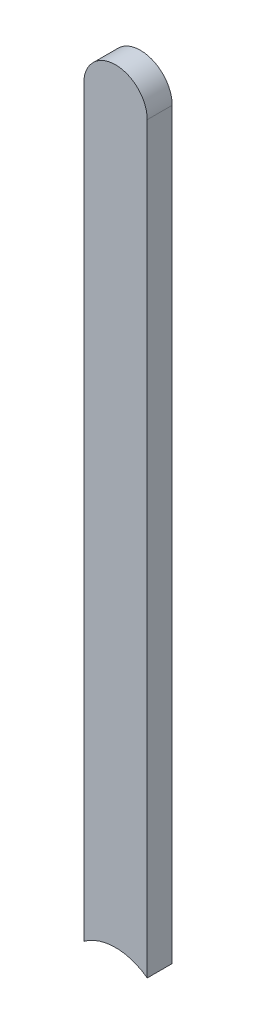
ISO-10303-21;
HEADER;
FILE_DESCRIPTION(('STEP AP214'),'2;1');
FILE_NAME('part.step','',(''),(''),'','','');
FILE_SCHEMA(('AUTOMOTIVE_DESIGN { 1 0 10303 214 1 1 1 1 }'));
ENDSEC;
DATA;
#1=APPLICATION_CONTEXT('core data for automotive mechanical design processes');
#2=APPLICATION_PROTOCOL_DEFINITION('international standard','automotive_design',2000,#1);
#3=PRODUCT_CONTEXT('',#1,'mechanical');
#4=PRODUCT('Part','Part','',(#3));
#5=PRODUCT_RELATED_PRODUCT_CATEGORY('part','',(#4));
#6=PRODUCT_DEFINITION_FORMATION('','',#4);
#7=PRODUCT_DEFINITION_CONTEXT('part definition',#1,'design');
#8=PRODUCT_DEFINITION('design','',#6,#7);
#9=PRODUCT_DEFINITION_SHAPE('','',#8);
#10=(LENGTH_UNIT() NAMED_UNIT(*) SI_UNIT(.MILLI.,.METRE.));
#11=(NAMED_UNIT(*) PLANE_ANGLE_UNIT() SI_UNIT($,.RADIAN.));
#12=(NAMED_UNIT(*) SI_UNIT($,.STERADIAN.) SOLID_ANGLE_UNIT());
#13=UNCERTAINTY_MEASURE_WITH_UNIT(LENGTH_MEASURE(1.E-05),#10,'distance_accuracy_value','');
#14=(GEOMETRIC_REPRESENTATION_CONTEXT(3) GLOBAL_UNCERTAINTY_ASSIGNED_CONTEXT((#13)) GLOBAL_UNIT_ASSIGNED_CONTEXT((#10,
#11,#12)) REPRESENTATION_CONTEXT('',''));
#15=CARTESIAN_POINT('',(0.,0.,0.));
#16=DIRECTION('',(0.,0.,1.));
#17=DIRECTION('',(1.,0.,0.));
#18=AXIS2_PLACEMENT_3D('',#15,#16,#17);
#19=CARTESIAN_POINT('',(134.366,66.1267482311035,0.));
#20=DIRECTION('',(-1.,0.,0.));
#21=DIRECTION('',(0.,1.,0.));
#22=AXIS2_PLACEMENT_3D('',#19,#20,#21);
#23=PLANE('',#22);
#24=DIRECTION('',(0.,1.,0.));
#25=VECTOR('',#24,1.);
#26=CARTESIAN_POINT('',(134.366,65.786,0.1999996));
#27=LINE('',#26,#25);
#28=CARTESIAN_POINT('',(134.366,66.1267482311035,0.1999996));
#29=VERTEX_POINT('',#28);
#30=CARTESIAN_POINT('',(134.366,72.0787992,0.1999996));
#31=VERTEX_POINT('',#30);
#32=EDGE_CURVE('E11',#29,#31,#27,.T.);
#33=ORIENTED_EDGE('',*,*,#32,.F.);
#34=DIRECTION('',(0.,0.,1.));
#35=VECTOR('',#34,1.);
#36=CARTESIAN_POINT('',(134.366,66.1267482311035,0.));
#37=LINE('',#36,#35);
#38=CARTESIAN_POINT('',(134.366,66.1267482311035,0.));
#39=VERTEX_POINT('',#38);
#40=EDGE_CURVE('E24',#39,#29,#37,.T.);
#41=ORIENTED_EDGE('',*,*,#40,.F.);
#42=DIRECTION('',(0.,1.,0.));
#43=VECTOR('',#42,1.);
#44=CARTESIAN_POINT('',(134.366,65.786,0.));
#45=LINE('',#44,#43);
#46=CARTESIAN_POINT('',(134.366,72.0787992,0.));
#47=VERTEX_POINT('',#46);
#48=EDGE_CURVE('E75',#39,#47,#45,.T.);
#49=ORIENTED_EDGE('',*,*,#48,.T.);
#50=DIRECTION('',(0.,0.,1.));
#51=VECTOR('',#50,1.);
#52=CARTESIAN_POINT('',(134.366,72.0787992,0.));
#53=LINE('',#52,#51);
#54=EDGE_CURVE('E37',#47,#31,#53,.T.);
#55=ORIENTED_EDGE('',*,*,#54,.T.);
#56=EDGE_LOOP('',(#33,#41,#49,#55));
#57=FACE_BOUND('',#56,.T.);
#58=ADVANCED_FACE('F17',(#57),#23,.F.);
#59=CARTESIAN_POINT('',(134.112,72.0787992,0.));
#60=DIRECTION('',(0.,0.,-1.));
#61=DIRECTION('',(1.,0.,0.));
#62=AXIS2_PLACEMENT_3D('',#59,#60,#61);
#63=CYLINDRICAL_SURFACE('',#62,0.254);
#64=CARTESIAN_POINT('',(134.112,72.0787992,0.1999996));
#65=DIRECTION('',(0.,0.,1.));
#66=DIRECTION('',(1.,0.,0.));
#67=AXIS2_PLACEMENT_3D('',#64,#65,#66);
#68=CIRCLE('',#67,0.254);
#69=CARTESIAN_POINT('',(133.858,72.0787992,0.1999996));
#70=VERTEX_POINT('',#69);
#71=EDGE_CURVE('E83',#31,#70,#68,.T.);
#72=ORIENTED_EDGE('',*,*,#71,.F.);
#73=ORIENTED_EDGE('',*,*,#54,.F.);
#74=CARTESIAN_POINT('',(134.112,72.0787992,0.));
#75=DIRECTION('',(0.,0.,1.));
#76=DIRECTION('',(1.,0.,0.));
#77=AXIS2_PLACEMENT_3D('',#74,#75,#76);
#78=CIRCLE('',#77,0.254);
#79=CARTESIAN_POINT('',(133.858,72.0787992,0.));
#80=VERTEX_POINT('',#79);
#81=EDGE_CURVE('E81',#47,#80,#78,.T.);
#82=ORIENTED_EDGE('',*,*,#81,.T.);
#83=DIRECTION('',(0.,0.,1.));
#84=VECTOR('',#83,1.);
#85=CARTESIAN_POINT('',(133.858,72.0787992,0.));
#86=LINE('',#85,#84);
#87=EDGE_CURVE('E67',#80,#70,#86,.T.);
#88=ORIENTED_EDGE('',*,*,#87,.T.);
#89=EDGE_LOOP('',(#72,#73,#82,#88));
#90=FACE_BOUND('',#89,.T.);
#91=ADVANCED_FACE('F89',(#90),#63,.T.);
#92=CARTESIAN_POINT('',(133.858,72.0787992,0.));
#93=DIRECTION('',(1.,0.,0.));
#94=DIRECTION('',(0.,-1.,0.));
#95=AXIS2_PLACEMENT_3D('',#92,#93,#94);
#96=PLANE('',#95);
#97=DIRECTION('',(0.,-1.,0.));
#98=VECTOR('',#97,1.);
#99=CARTESIAN_POINT('',(133.858,72.0787992,0.1999996));
#100=LINE('',#99,#98);
#101=CARTESIAN_POINT('',(133.858,66.1267482311035,0.1999996));
#102=VERTEX_POINT('',#101);
#103=EDGE_CURVE('E71',#70,#102,#100,.T.);
#104=ORIENTED_EDGE('',*,*,#103,.F.);
#105=ORIENTED_EDGE('',*,*,#87,.F.);
#106=DIRECTION('',(0.,-1.,0.));
#107=VECTOR('',#106,1.);
#108=CARTESIAN_POINT('',(133.858,72.0787992,0.));
#109=LINE('',#108,#107);
#110=CARTESIAN_POINT('',(133.858,66.1267482311035,0.));
#111=VERTEX_POINT('',#110);
#112=EDGE_CURVE('E63',#80,#111,#109,.T.);
#113=ORIENTED_EDGE('',*,*,#112,.T.);
#114=DIRECTION('',(0.,0.,1.));
#115=VECTOR('',#114,1.);
#116=CARTESIAN_POINT('',(133.858,66.1267482311035,0.));
#117=LINE('',#116,#115);
#118=EDGE_CURVE('E53',#111,#102,#117,.T.);
#119=ORIENTED_EDGE('',*,*,#118,.T.);
#120=EDGE_LOOP('',(#104,#105,#113,#119));
#121=FACE_BOUND('',#120,.T.);
#122=ADVANCED_FACE('F66',(#121),#96,.F.);
#123=CARTESIAN_POINT('',(134.112,65.786,0.));
#124=DIRECTION('',(0.,0.,-1.));
#125=DIRECTION('',(1.,0.,0.));
#126=AXIS2_PLACEMENT_3D('',#123,#124,#125);
#127=CYLINDRICAL_SURFACE('',#126,0.42500042);
#128=ORIENTED_EDGE('',*,*,#40,.T.);
#129=CARTESIAN_POINT('',(134.112,65.786,0.1999996));
#130=DIRECTION('',(0.,0.,1.));
#131=DIRECTION('',(1.,0.,0.));
#132=AXIS2_PLACEMENT_3D('',#129,#130,#131);
#133=CIRCLE('',#132,0.42500042);
#134=EDGE_CURVE('E59',#29,#102,#133,.T.);
#135=ORIENTED_EDGE('',*,*,#134,.T.);
#136=ORIENTED_EDGE('',*,*,#118,.F.);
#137=CARTESIAN_POINT('',(134.112,65.786,0.));
#138=DIRECTION('',(0.,0.,1.));
#139=DIRECTION('',(1.,0.,0.));
#140=AXIS2_PLACEMENT_3D('',#137,#138,#139);
#141=CIRCLE('',#140,0.42500042);
#142=EDGE_CURVE('E57',#39,#111,#141,.T.);
#143=ORIENTED_EDGE('',*,*,#142,.F.);
#144=EDGE_LOOP('',(#128,#135,#136,#143));
#145=FACE_BOUND('',#144,.T.);
#146=ADVANCED_FACE('F55',(#145),#127,.F.);
#147=CARTESIAN_POINT('',(134.366,65.786,0.));
#148=DIRECTION('',(0.,0.,-1.));
#149=DIRECTION('',(-1.,0.,0.));
#150=AXIS2_PLACEMENT_3D('',#147,#148,#149);
#151=PLANE('',#150);
#152=ORIENTED_EDGE('',*,*,#48,.F.);
#153=ORIENTED_EDGE('',*,*,#142,.T.);
#154=ORIENTED_EDGE('',*,*,#112,.F.);
#155=ORIENTED_EDGE('',*,*,#81,.F.);
#156=EDGE_LOOP('',(#152,#153,#154,#155));
#157=FACE_BOUND('',#156,.T.);
#158=ADVANCED_FACE('F74',(#157),#151,.T.);
#159=CARTESIAN_POINT('',(134.366,65.786,0.1999996));
#160=DIRECTION('',(0.,0.,-1.));
#161=DIRECTION('',(-1.,0.,0.));
#162=AXIS2_PLACEMENT_3D('',#159,#160,#161);
#163=PLANE('',#162);
#164=ORIENTED_EDGE('',*,*,#134,.F.);
#165=ORIENTED_EDGE('',*,*,#32,.T.);
#166=ORIENTED_EDGE('',*,*,#71,.T.);
#167=ORIENTED_EDGE('',*,*,#103,.T.);
#168=EDGE_LOOP('',(#164,#165,#166,#167));
#169=FACE_BOUND('',#168,.T.);
#170=ADVANCED_FACE('F91',(#169),#163,.F.);
#171=CLOSED_SHELL('',(#58,#91,#122,#146,#158,#170));
#172=MANIFOLD_SOLID_BREP('B1',#171);
#173=ADVANCED_BREP_SHAPE_REPRESENTATION('',(#18,#172),#14);
#174=SHAPE_DEFINITION_REPRESENTATION(#9,#173);
ENDSEC;
END-ISO-10303-21;
